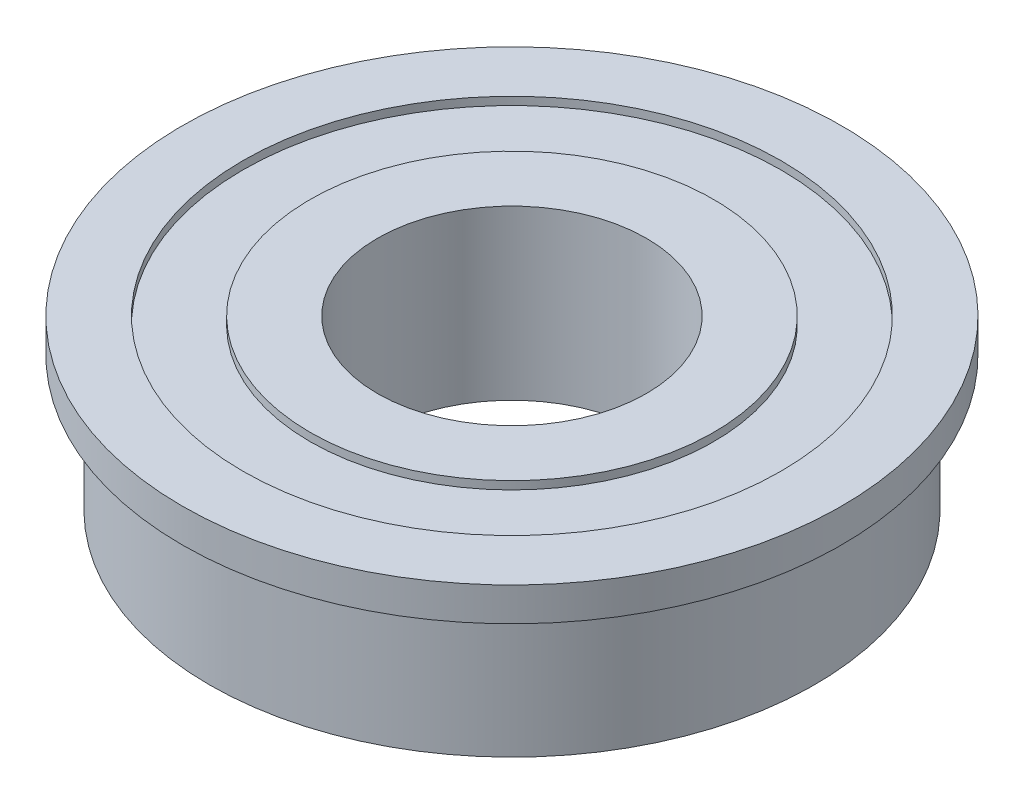
ISO-10303-21;
HEADER;
FILE_DESCRIPTION(('STEP AP214'),'2;1');
FILE_NAME('part.step','',(''),(''),'','','');
FILE_SCHEMA(('AUTOMOTIVE_DESIGN { 1 0 10303 214 1 1 1 1 }'));
ENDSEC;
DATA;
#1=APPLICATION_CONTEXT('core data for automotive mechanical design processes');
#2=APPLICATION_PROTOCOL_DEFINITION('international standard','automotive_design',2000,#1);
#3=PRODUCT_CONTEXT('',#1,'mechanical');
#4=PRODUCT('Part','Part','',(#3));
#5=PRODUCT_RELATED_PRODUCT_CATEGORY('part','',(#4));
#6=PRODUCT_DEFINITION_FORMATION('','',#4);
#7=PRODUCT_DEFINITION_CONTEXT('part definition',#1,'design');
#8=PRODUCT_DEFINITION('design','',#6,#7);
#9=PRODUCT_DEFINITION_SHAPE('','',#8);
#10=(LENGTH_UNIT() NAMED_UNIT(*) SI_UNIT(.MILLI.,.METRE.));
#11=(NAMED_UNIT(*) PLANE_ANGLE_UNIT() SI_UNIT($,.RADIAN.));
#12=(NAMED_UNIT(*) SI_UNIT($,.STERADIAN.) SOLID_ANGLE_UNIT());
#13=UNCERTAINTY_MEASURE_WITH_UNIT(LENGTH_MEASURE(1.E-05),#10,'distance_accuracy_value','');
#14=(GEOMETRIC_REPRESENTATION_CONTEXT(3) GLOBAL_UNCERTAINTY_ASSIGNED_CONTEXT((#13)) GLOBAL_UNIT_ASSIGNED_CONTEXT((#10,
#11,#12)) REPRESENTATION_CONTEXT('',''));
#15=CARTESIAN_POINT('',(0.,0.,0.));
#16=DIRECTION('',(0.,0.,1.));
#17=DIRECTION('',(1.,0.,0.));
#18=AXIS2_PLACEMENT_3D('',#15,#16,#17);
#19=CARTESIAN_POINT('',(0.,0.,0.));
#20=DIRECTION('',(0.,1.,0.));
#21=DIRECTION('',(0.,0.,1.));
#22=AXIS2_PLACEMENT_3D('',#19,#20,#21);
#23=CYLINDRICAL_SURFACE('',#22,9.525);
#24=CARTESIAN_POINT('',(0.,7.5565,0.));
#25=DIRECTION('',(0.,1.,0.));
#26=DIRECTION('',(0.,0.,1.));
#27=AXIS2_PLACEMENT_3D('',#24,#25,#26);
#28=CIRCLE('',#27,9.525);
#29=CARTESIAN_POINT('',(0.,7.5565,9.525));
#30=VERTEX_POINT('',#29);
#31=EDGE_CURVE('E69',#30,#30,#28,.T.);
#32=ORIENTED_EDGE('',*,*,#31,.T.);
#33=EDGE_LOOP('',(#32));
#34=FACE_BOUND('',#33,.T.);
#35=CARTESIAN_POINT('',(0.,7.9375,0.));
#36=DIRECTION('',(0.,1.,0.));
#37=DIRECTION('',(0.,0.,1.));
#38=AXIS2_PLACEMENT_3D('',#35,#36,#37);
#39=CIRCLE('',#38,9.525);
#40=CARTESIAN_POINT('',(0.,7.9375,9.525));
#41=VERTEX_POINT('',#40);
#42=EDGE_CURVE('E10',#41,#41,#39,.T.);
#43=ORIENTED_EDGE('',*,*,#42,.F.);
#44=EDGE_LOOP('',(#43));
#45=FACE_BOUND('',#44,.T.);
#46=ADVANCED_FACE('F35',(#34,#45),#23,.T.);
#47=CARTESIAN_POINT('',(6.35,7.9375,0.));
#48=DIRECTION('',(0.,1.,0.));
#49=DIRECTION('',(0.,0.,1.));
#50=AXIS2_PLACEMENT_3D('',#47,#48,#49);
#51=PLANE('',#50);
#52=ORIENTED_EDGE('',*,*,#42,.T.);
#53=EDGE_LOOP('',(#52));
#54=FACE_BOUND('',#53,.T.);
#55=CARTESIAN_POINT('',(0.,7.9375,0.));
#56=DIRECTION('',(0.,1.,0.));
#57=DIRECTION('',(0.,0.,1.));
#58=AXIS2_PLACEMENT_3D('',#55,#56,#57);
#59=CIRCLE('',#58,6.35);
#60=CARTESIAN_POINT('',(0.,7.9375,6.35));
#61=VERTEX_POINT('',#60);
#62=EDGE_CURVE('E41',#61,#61,#59,.T.);
#63=ORIENTED_EDGE('',*,*,#62,.F.);
#64=EDGE_LOOP('',(#63));
#65=FACE_BOUND('',#64,.T.);
#66=ADVANCED_FACE('F87',(#54,#65),#51,.T.);
#67=CARTESIAN_POINT('',(0.,0.,0.));
#68=DIRECTION('',(0.,1.,0.));
#69=DIRECTION('',(0.,0.,1.));
#70=AXIS2_PLACEMENT_3D('',#67,#68,#69);
#71=CYLINDRICAL_SURFACE('',#70,6.35);
#72=ORIENTED_EDGE('',*,*,#62,.T.);
#73=EDGE_LOOP('',(#72));
#74=FACE_BOUND('',#73,.T.);
#75=CARTESIAN_POINT('',(0.,0.,0.));
#76=DIRECTION('',(0.,1.,0.));
#77=DIRECTION('',(0.,0.,1.));
#78=AXIS2_PLACEMENT_3D('',#75,#76,#77);
#79=CIRCLE('',#78,6.35);
#80=CARTESIAN_POINT('',(0.,0.,6.35));
#81=VERTEX_POINT('',#80);
#82=EDGE_CURVE('E45',#81,#81,#79,.T.);
#83=ORIENTED_EDGE('',*,*,#82,.F.);
#84=EDGE_LOOP('',(#83));
#85=FACE_BOUND('',#84,.T.);
#86=ADVANCED_FACE('F91',(#74,#85),#71,.F.);
#87=CARTESIAN_POINT('',(14.2875,0.,0.));
#88=DIRECTION('',(0.,-1.,0.));
#89=DIRECTION('',(0.,0.,-1.));
#90=AXIS2_PLACEMENT_3D('',#87,#88,#89);
#91=PLANE('',#90);
#92=ORIENTED_EDGE('',*,*,#82,.T.);
#93=EDGE_LOOP('',(#92));
#94=FACE_BOUND('',#93,.T.);
#95=CARTESIAN_POINT('',(0.,0.,0.));
#96=DIRECTION('',(0.,1.,0.));
#97=DIRECTION('',(0.,0.,1.));
#98=AXIS2_PLACEMENT_3D('',#95,#96,#97);
#99=CIRCLE('',#98,14.2875);
#100=CARTESIAN_POINT('',(0.,0.,14.2875));
#101=VERTEX_POINT('',#100);
#102=EDGE_CURVE('E49',#101,#101,#99,.T.);
#103=ORIENTED_EDGE('',*,*,#102,.F.);
#104=EDGE_LOOP('',(#103));
#105=FACE_BOUND('',#104,.T.);
#106=ADVANCED_FACE('F95',(#94,#105),#91,.T.);
#107=CARTESIAN_POINT('',(0.,0.,0.));
#108=DIRECTION('',(0.,1.,0.));
#109=DIRECTION('',(0.,0.,1.));
#110=AXIS2_PLACEMENT_3D('',#107,#108,#109);
#111=CYLINDRICAL_SURFACE('',#110,14.2875);
#112=ORIENTED_EDGE('',*,*,#102,.T.);
#113=EDGE_LOOP('',(#112));
#114=FACE_BOUND('',#113,.T.);
#115=CARTESIAN_POINT('',(0.,6.35,0.));
#116=DIRECTION('',(0.,1.,0.));
#117=DIRECTION('',(0.,0.,1.));
#118=AXIS2_PLACEMENT_3D('',#115,#116,#117);
#119=CIRCLE('',#118,14.2875);
#120=CARTESIAN_POINT('',(0.,6.35,14.2875));
#121=VERTEX_POINT('',#120);
#122=EDGE_CURVE('E54',#121,#121,#119,.T.);
#123=ORIENTED_EDGE('',*,*,#122,.F.);
#124=EDGE_LOOP('',(#123));
#125=FACE_BOUND('',#124,.T.);
#126=ADVANCED_FACE('F101',(#114,#125),#111,.T.);
#127=CARTESIAN_POINT('',(15.5575,6.35,0.));
#128=DIRECTION('',(0.,-1.,0.));
#129=DIRECTION('',(0.,0.,-1.));
#130=AXIS2_PLACEMENT_3D('',#127,#128,#129);
#131=PLANE('',#130);
#132=ORIENTED_EDGE('',*,*,#122,.T.);
#133=EDGE_LOOP('',(#132));
#134=FACE_BOUND('',#133,.T.);
#135=CARTESIAN_POINT('',(0.,6.35,0.));
#136=DIRECTION('',(0.,1.,0.));
#137=DIRECTION('',(0.,0.,1.));
#138=AXIS2_PLACEMENT_3D('',#135,#136,#137);
#139=CIRCLE('',#138,15.5575);
#140=CARTESIAN_POINT('',(0.,6.35,15.5575));
#141=VERTEX_POINT('',#140);
#142=EDGE_CURVE('E57',#141,#141,#139,.T.);
#143=ORIENTED_EDGE('',*,*,#142,.F.);
#144=EDGE_LOOP('',(#143));
#145=FACE_BOUND('',#144,.T.);
#146=ADVANCED_FACE('F105',(#134,#145),#131,.T.);
#147=CARTESIAN_POINT('',(0.,0.,0.));
#148=DIRECTION('',(0.,1.,0.));
#149=DIRECTION('',(0.,0.,1.));
#150=AXIS2_PLACEMENT_3D('',#147,#148,#149);
#151=CYLINDRICAL_SURFACE('',#150,15.5575);
#152=ORIENTED_EDGE('',*,*,#142,.T.);
#153=EDGE_LOOP('',(#152));
#154=FACE_BOUND('',#153,.T.);
#155=CARTESIAN_POINT('',(0.,7.9375,0.));
#156=DIRECTION('',(0.,1.,0.));
#157=DIRECTION('',(0.,0.,1.));
#158=AXIS2_PLACEMENT_3D('',#155,#156,#157);
#159=CIRCLE('',#158,15.5575);
#160=CARTESIAN_POINT('',(0.,7.9375,15.5575));
#161=VERTEX_POINT('',#160);
#162=EDGE_CURVE('E60',#161,#161,#159,.T.);
#163=ORIENTED_EDGE('',*,*,#162,.F.);
#164=EDGE_LOOP('',(#163));
#165=FACE_BOUND('',#164,.T.);
#166=ADVANCED_FACE('F109',(#154,#165),#151,.T.);
#167=CARTESIAN_POINT('',(12.7,7.9375,0.));
#168=DIRECTION('',(0.,1.,0.));
#169=DIRECTION('',(0.,0.,1.));
#170=AXIS2_PLACEMENT_3D('',#167,#168,#169);
#171=PLANE('',#170);
#172=ORIENTED_EDGE('',*,*,#162,.T.);
#173=EDGE_LOOP('',(#172));
#174=FACE_BOUND('',#173,.T.);
#175=CARTESIAN_POINT('',(0.,7.9375,0.));
#176=DIRECTION('',(0.,1.,0.));
#177=DIRECTION('',(0.,0.,1.));
#178=AXIS2_PLACEMENT_3D('',#175,#176,#177);
#179=CIRCLE('',#178,12.7);
#180=CARTESIAN_POINT('',(0.,7.9375,12.7));
#181=VERTEX_POINT('',#180);
#182=EDGE_CURVE('E63',#181,#181,#179,.T.);
#183=ORIENTED_EDGE('',*,*,#182,.F.);
#184=EDGE_LOOP('',(#183));
#185=FACE_BOUND('',#184,.T.);
#186=ADVANCED_FACE('F83',(#174,#185),#171,.T.);
#187=CARTESIAN_POINT('',(0.,0.,0.));
#188=DIRECTION('',(0.,1.,0.));
#189=DIRECTION('',(0.,0.,1.));
#190=AXIS2_PLACEMENT_3D('',#187,#188,#189);
#191=CYLINDRICAL_SURFACE('',#190,12.7);
#192=ORIENTED_EDGE('',*,*,#182,.T.);
#193=EDGE_LOOP('',(#192));
#194=FACE_BOUND('',#193,.T.);
#195=CARTESIAN_POINT('',(0.,7.5565,0.));
#196=DIRECTION('',(0.,1.,0.));
#197=DIRECTION('',(0.,0.,1.));
#198=AXIS2_PLACEMENT_3D('',#195,#196,#197);
#199=CIRCLE('',#198,12.7);
#200=CARTESIAN_POINT('',(0.,7.5565,12.7));
#201=VERTEX_POINT('',#200);
#202=EDGE_CURVE('E66',#201,#201,#199,.T.);
#203=ORIENTED_EDGE('',*,*,#202,.F.);
#204=EDGE_LOOP('',(#203));
#205=FACE_BOUND('',#204,.T.);
#206=ADVANCED_FACE('F77',(#194,#205),#191,.F.);
#207=CARTESIAN_POINT('',(9.525,7.5565,0.));
#208=DIRECTION('',(0.,1.,0.));
#209=DIRECTION('',(0.,0.,1.));
#210=AXIS2_PLACEMENT_3D('',#207,#208,#209);
#211=PLANE('',#210);
#212=ORIENTED_EDGE('',*,*,#202,.T.);
#213=EDGE_LOOP('',(#212));
#214=FACE_BOUND('',#213,.T.);
#215=ORIENTED_EDGE('',*,*,#31,.F.);
#216=EDGE_LOOP('',(#215));
#217=FACE_BOUND('',#216,.T.);
#218=ADVANCED_FACE('F75',(#214,#217),#211,.T.);
#219=CLOSED_SHELL('',(#46,#66,#86,#106,#126,#146,#166,#186,#206,#218));
#220=MANIFOLD_SOLID_BREP('B2',#219);
#221=ADVANCED_BREP_SHAPE_REPRESENTATION('',(#18,#220),#14);
#222=SHAPE_DEFINITION_REPRESENTATION(#9,#221);
ENDSEC;
END-ISO-10303-21;
